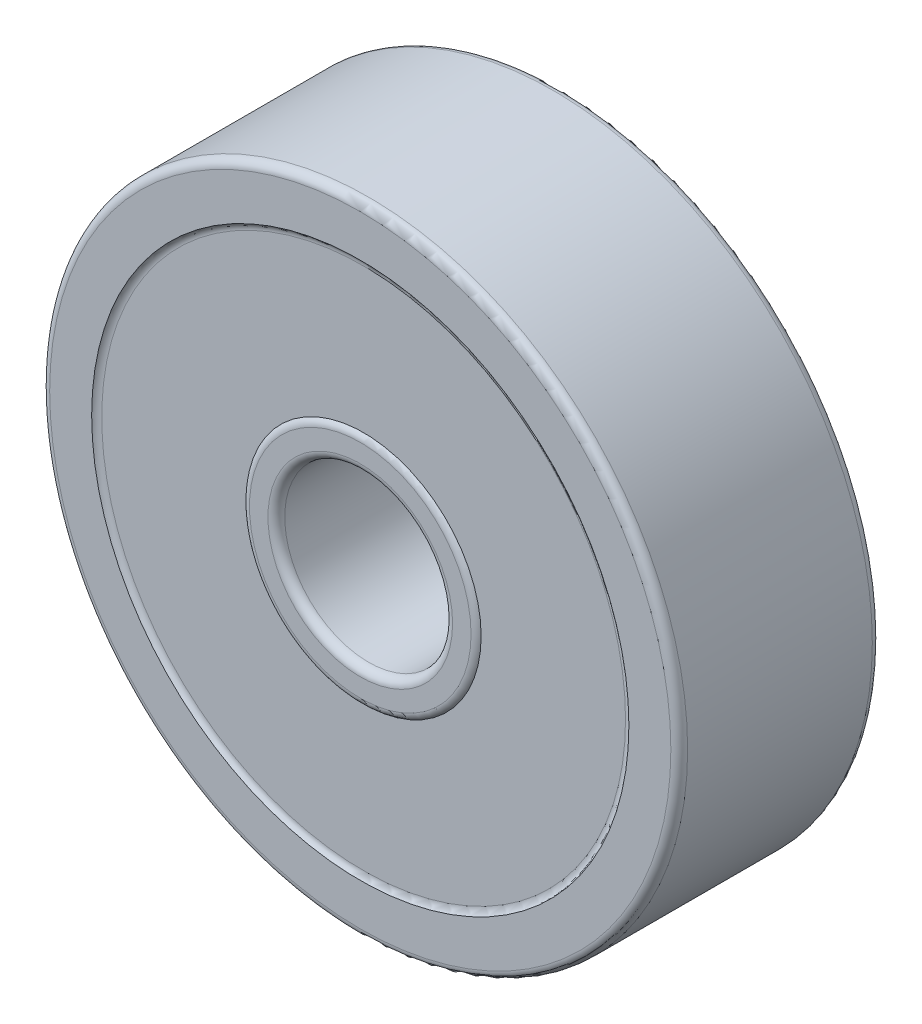
ISO-10303-21;
HEADER;
FILE_DESCRIPTION(('STEP AP214'),'2;1');
FILE_NAME('part.step','',(''),(''),'','','');
FILE_SCHEMA(('AUTOMOTIVE_DESIGN { 1 0 10303 214 1 1 1 1 }'));
ENDSEC;
DATA;
#1=APPLICATION_CONTEXT('core data for automotive mechanical design processes');
#2=APPLICATION_PROTOCOL_DEFINITION('international standard','automotive_design',2000,#1);
#3=PRODUCT_CONTEXT('',#1,'mechanical');
#4=PRODUCT('Part','Part','',(#3));
#5=PRODUCT_RELATED_PRODUCT_CATEGORY('part','',(#4));
#6=PRODUCT_DEFINITION_FORMATION('','',#4);
#7=PRODUCT_DEFINITION_CONTEXT('part definition',#1,'design');
#8=PRODUCT_DEFINITION('design','',#6,#7);
#9=PRODUCT_DEFINITION_SHAPE('','',#8);
#10=(LENGTH_UNIT() NAMED_UNIT(*) SI_UNIT(.MILLI.,.METRE.));
#11=(NAMED_UNIT(*) PLANE_ANGLE_UNIT() SI_UNIT($,.RADIAN.));
#12=(NAMED_UNIT(*) SI_UNIT($,.STERADIAN.) SOLID_ANGLE_UNIT());
#13=UNCERTAINTY_MEASURE_WITH_UNIT(LENGTH_MEASURE(1.E-05),#10,'distance_accuracy_value','');
#14=(GEOMETRIC_REPRESENTATION_CONTEXT(3) GLOBAL_UNCERTAINTY_ASSIGNED_CONTEXT((#13)) GLOBAL_UNIT_ASSIGNED_CONTEXT((#10,
#11,#12)) REPRESENTATION_CONTEXT('',''));
#15=CARTESIAN_POINT('',(0.,0.,0.));
#16=DIRECTION('',(0.,0.,1.));
#17=DIRECTION('',(1.,0.,0.));
#18=AXIS2_PLACEMENT_3D('',#15,#16,#17);
#19=CARTESIAN_POINT('',(0.,0.,-3.));
#20=DIRECTION('',(0.,0.,1.));
#21=DIRECTION('',(1.,0.,0.));
#22=AXIS2_PLACEMENT_3D('',#19,#20,#21);
#23=CYLINDRICAL_SURFACE('',#22,9.5);
#24=CARTESIAN_POINT('',(0.,0.,-2.75));
#25=DIRECTION('',(0.,0.,1.));
#26=DIRECTION('',(1.,0.,0.));
#27=AXIS2_PLACEMENT_3D('',#24,#25,#26);
#28=CIRCLE('',#27,9.5);
#29=CARTESIAN_POINT('',(9.5,0.,-2.75));
#30=VERTEX_POINT('',#29);
#31=EDGE_CURVE('E63',#30,#30,#28,.T.);
#32=ORIENTED_EDGE('',*,*,#31,.T.);
#33=EDGE_LOOP('',(#32));
#34=FACE_BOUND('',#33,.T.);
#35=CARTESIAN_POINT('',(0.,0.,2.75));
#36=DIRECTION('',(0.,0.,1.));
#37=DIRECTION('',(1.,0.,0.));
#38=AXIS2_PLACEMENT_3D('',#35,#36,#37);
#39=CIRCLE('',#38,9.5);
#40=CARTESIAN_POINT('',(9.5,0.,2.75));
#41=VERTEX_POINT('',#40);
#42=EDGE_CURVE('E66',#41,#41,#39,.F.);
#43=ORIENTED_EDGE('',*,*,#42,.T.);
#44=EDGE_LOOP('',(#43));
#45=FACE_BOUND('',#44,.T.);
#46=ADVANCED_FACE('F31',(#34,#45),#23,.T.);
#47=CARTESIAN_POINT('',(0.,0.,-3.));
#48=DIRECTION('',(0.,0.,1.));
#49=DIRECTION('',(1.,0.,0.));
#50=AXIS2_PLACEMENT_3D('',#47,#48,#49);
#51=PLANE('',#50);
#52=CARTESIAN_POINT('',(0.,0.,-3.));
#53=DIRECTION('',(0.,0.,1.));
#54=DIRECTION('',(1.,0.,0.));
#55=AXIS2_PLACEMENT_3D('',#52,#53,#54);
#56=CIRCLE('',#55,9.25);
#57=CARTESIAN_POINT('',(9.25,0.,-3.));
#58=VERTEX_POINT('',#57);
#59=EDGE_CURVE('E57',#58,#58,#56,.F.);
#60=ORIENTED_EDGE('',*,*,#59,.T.);
#61=EDGE_LOOP('',(#60));
#62=FACE_BOUND('',#61,.T.);
#63=CARTESIAN_POINT('',(0.,0.,-3.));
#64=DIRECTION('',(0.,0.,1.));
#65=DIRECTION('',(1.,0.,0.));
#66=AXIS2_PLACEMENT_3D('',#63,#64,#65);
#67=CIRCLE('',#66,8.2);
#68=CARTESIAN_POINT('',(8.2,0.,-3.));
#69=VERTEX_POINT('',#68);
#70=EDGE_CURVE('E60',#69,#69,#67,.T.);
#71=ORIENTED_EDGE('',*,*,#70,.T.);
#72=EDGE_LOOP('',(#71));
#73=FACE_BOUND('',#72,.T.);
#74=ADVANCED_FACE('F115',(#62,#73),#51,.F.);
#75=CARTESIAN_POINT('',(0.,0.,3.));
#76=DIRECTION('',(0.,0.,1.));
#77=DIRECTION('',(1.,0.,0.));
#78=AXIS2_PLACEMENT_3D('',#75,#76,#77);
#79=PLANE('',#78);
#80=CARTESIAN_POINT('',(0.,0.,3.));
#81=DIRECTION('',(0.,0.,1.));
#82=DIRECTION('',(1.,0.,0.));
#83=AXIS2_PLACEMENT_3D('',#80,#81,#82);
#84=CIRCLE('',#83,9.25);
#85=CARTESIAN_POINT('',(9.25,0.,3.));
#86=VERTEX_POINT('',#85);
#87=EDGE_CURVE('E10',#86,#86,#84,.T.);
#88=ORIENTED_EDGE('',*,*,#87,.T.);
#89=EDGE_LOOP('',(#88));
#90=FACE_BOUND('',#89,.T.);
#91=CARTESIAN_POINT('',(0.,0.,3.));
#92=DIRECTION('',(0.,0.,1.));
#93=DIRECTION('',(1.,0.,0.));
#94=AXIS2_PLACEMENT_3D('',#91,#92,#93);
#95=CIRCLE('',#94,8.);
#96=CARTESIAN_POINT('',(8.,0.,3.));
#97=VERTEX_POINT('',#96);
#98=EDGE_CURVE('E75',#97,#97,#95,.F.);
#99=ORIENTED_EDGE('',*,*,#98,.T.);
#100=EDGE_LOOP('',(#99));
#101=FACE_BOUND('',#100,.T.);
#102=ADVANCED_FACE('F95',(#90,#101),#79,.T.);
#103=CARTESIAN_POINT('',(0.,0.,-2.9));
#104=DIRECTION('',(0.,0.,1.));
#105=DIRECTION('',(1.,0.,0.));
#106=AXIS2_PLACEMENT_3D('',#103,#104,#105);
#107=PLANE('',#106);
#108=CARTESIAN_POINT('',(0.,0.,-2.9));
#109=DIRECTION('',(0.,0.,1.));
#110=DIRECTION('',(1.,0.,0.));
#111=AXIS2_PLACEMENT_3D('',#108,#109,#110);
#112=CIRCLE('',#111,3.5);
#113=CARTESIAN_POINT('',(3.5,0.,-2.9));
#114=VERTEX_POINT('',#113);
#115=EDGE_CURVE('E84',#114,#114,#112,.F.);
#116=ORIENTED_EDGE('',*,*,#115,.F.);
#117=EDGE_LOOP('',(#116));
#118=FACE_BOUND('',#117,.T.);
#119=CARTESIAN_POINT('',(0.,0.,-2.9));
#120=DIRECTION('',(0.,0.,1.));
#121=DIRECTION('',(1.,0.,0.));
#122=AXIS2_PLACEMENT_3D('',#119,#120,#121);
#123=CIRCLE('',#122,8.);
#124=CARTESIAN_POINT('',(8.,0.,-2.9));
#125=VERTEX_POINT('',#124);
#126=EDGE_CURVE('E78',#125,#125,#123,.T.);
#127=ORIENTED_EDGE('',*,*,#126,.F.);
#128=EDGE_LOOP('',(#127));
#129=FACE_BOUND('',#128,.T.);
#130=ADVANCED_FACE('F91',(#118,#129),#107,.F.);
#131=CARTESIAN_POINT('',(0.,0.,2.9));
#132=DIRECTION('',(0.,0.,1.));
#133=DIRECTION('',(1.,0.,0.));
#134=AXIS2_PLACEMENT_3D('',#131,#132,#133);
#135=PLANE('',#134);
#136=CARTESIAN_POINT('',(0.,0.,2.9));
#137=DIRECTION('',(0.,0.,1.));
#138=DIRECTION('',(1.,0.,0.));
#139=AXIS2_PLACEMENT_3D('',#136,#137,#138);
#140=CIRCLE('',#139,7.8);
#141=CARTESIAN_POINT('',(7.8,0.,2.9));
#142=VERTEX_POINT('',#141);
#143=EDGE_CURVE('E38',#142,#142,#140,.T.);
#144=ORIENTED_EDGE('',*,*,#143,.T.);
#145=EDGE_LOOP('',(#144));
#146=FACE_BOUND('',#145,.T.);
#147=CARTESIAN_POINT('',(0.,0.,2.9));
#148=DIRECTION('',(0.,0.,1.));
#149=DIRECTION('',(1.,0.,0.));
#150=AXIS2_PLACEMENT_3D('',#147,#148,#149);
#151=CIRCLE('',#150,3.5);
#152=CARTESIAN_POINT('',(3.5,0.,2.9));
#153=VERTEX_POINT('',#152);
#154=EDGE_CURVE('E81',#153,#153,#151,.T.);
#155=ORIENTED_EDGE('',*,*,#154,.F.);
#156=EDGE_LOOP('',(#155));
#157=FACE_BOUND('',#156,.T.);
#158=ADVANCED_FACE('F94',(#146,#157),#135,.T.);
#159=CARTESIAN_POINT('',(0.,0.,-3.));
#160=DIRECTION('',(0.,0.,1.));
#161=DIRECTION('',(1.,0.,0.));
#162=AXIS2_PLACEMENT_3D('',#159,#160,#161);
#163=PLANE('',#162);
#164=CARTESIAN_POINT('',(0.,0.,-3.));
#165=DIRECTION('',(0.,0.,1.));
#166=DIRECTION('',(1.,0.,0.));
#167=AXIS2_PLACEMENT_3D('',#164,#165,#166);
#168=CIRCLE('',#167,3.3);
#169=CARTESIAN_POINT('',(3.3,0.,-3.));
#170=VERTEX_POINT('',#169);
#171=EDGE_CURVE('E51',#170,#170,#168,.F.);
#172=ORIENTED_EDGE('',*,*,#171,.T.);
#173=EDGE_LOOP('',(#172));
#174=FACE_BOUND('',#173,.T.);
#175=CARTESIAN_POINT('',(0.,0.,-3.));
#176=DIRECTION('',(0.,0.,1.));
#177=DIRECTION('',(1.,0.,0.));
#178=AXIS2_PLACEMENT_3D('',#175,#176,#177);
#179=CIRCLE('',#178,2.75);
#180=CARTESIAN_POINT('',(2.75,0.,-3.));
#181=VERTEX_POINT('',#180);
#182=EDGE_CURVE('E54',#181,#181,#179,.T.);
#183=ORIENTED_EDGE('',*,*,#182,.T.);
#184=EDGE_LOOP('',(#183));
#185=FACE_BOUND('',#184,.T.);
#186=ADVANCED_FACE('F142',(#174,#185),#163,.F.);
#187=CARTESIAN_POINT('',(0.,0.,-3.));
#188=DIRECTION('',(0.,0.,1.));
#189=DIRECTION('',(1.,0.,0.));
#190=AXIS2_PLACEMENT_3D('',#187,#188,#189);
#191=CYLINDRICAL_SURFACE('',#190,2.5);
#192=CARTESIAN_POINT('',(0.,0.,-2.75));
#193=DIRECTION('',(0.,0.,1.));
#194=DIRECTION('',(1.,0.,0.));
#195=AXIS2_PLACEMENT_3D('',#192,#193,#194);
#196=CIRCLE('',#195,2.5);
#197=CARTESIAN_POINT('',(2.5,0.,-2.75));
#198=VERTEX_POINT('',#197);
#199=EDGE_CURVE('E42',#198,#198,#196,.F.);
#200=ORIENTED_EDGE('',*,*,#199,.T.);
#201=EDGE_LOOP('',(#200));
#202=FACE_BOUND('',#201,.T.);
#203=CARTESIAN_POINT('',(0.,0.,2.75));
#204=DIRECTION('',(0.,0.,1.));
#205=DIRECTION('',(1.,0.,0.));
#206=AXIS2_PLACEMENT_3D('',#203,#204,#205);
#207=CIRCLE('',#206,2.5);
#208=CARTESIAN_POINT('',(2.5,0.,2.75));
#209=VERTEX_POINT('',#208);
#210=EDGE_CURVE('E46',#209,#209,#207,.T.);
#211=ORIENTED_EDGE('',*,*,#210,.T.);
#212=EDGE_LOOP('',(#211));
#213=FACE_BOUND('',#212,.T.);
#214=ADVANCED_FACE('F134',(#202,#213),#191,.F.);
#215=CARTESIAN_POINT('',(0.,0.,3.));
#216=DIRECTION('',(0.,0.,1.));
#217=DIRECTION('',(1.,0.,0.));
#218=AXIS2_PLACEMENT_3D('',#215,#216,#217);
#219=PLANE('',#218);
#220=CARTESIAN_POINT('',(0.,0.,3.));
#221=DIRECTION('',(0.,0.,1.));
#222=DIRECTION('',(1.,0.,0.));
#223=AXIS2_PLACEMENT_3D('',#220,#221,#222);
#224=CIRCLE('',#223,3.3);
#225=CARTESIAN_POINT('',(3.3,0.,3.));
#226=VERTEX_POINT('',#225);
#227=EDGE_CURVE('E69',#226,#226,#224,.T.);
#228=ORIENTED_EDGE('',*,*,#227,.T.);
#229=EDGE_LOOP('',(#228));
#230=FACE_BOUND('',#229,.T.);
#231=CARTESIAN_POINT('',(0.,0.,3.));
#232=DIRECTION('',(0.,0.,1.));
#233=DIRECTION('',(1.,0.,0.));
#234=AXIS2_PLACEMENT_3D('',#231,#232,#233);
#235=CIRCLE('',#234,2.75);
#236=CARTESIAN_POINT('',(2.75,0.,3.));
#237=VERTEX_POINT('',#236);
#238=EDGE_CURVE('E72',#237,#237,#235,.F.);
#239=ORIENTED_EDGE('',*,*,#238,.T.);
#240=EDGE_LOOP('',(#239));
#241=FACE_BOUND('',#240,.T.);
#242=ADVANCED_FACE('F129',(#230,#241),#219,.T.);
#243=CARTESIAN_POINT('',(0.,0.,2.75));
#244=DIRECTION('',(0.,0.,-1.));
#245=DIRECTION('',(-1.,0.,0.));
#246=AXIS2_PLACEMENT_3D('',#243,#244,#245);
#247=TOROIDAL_SURFACE('',#246,3.3,0.25);
#248=ORIENTED_EDGE('',*,*,#227,.F.);
#249=EDGE_LOOP('',(#248));
#250=FACE_BOUND('',#249,.T.);
#251=ORIENTED_EDGE('',*,*,#154,.T.);
#252=EDGE_LOOP('',(#251));
#253=FACE_BOUND('',#252,.T.);
#254=ADVANCED_FACE('F110',(#250,#253),#247,.T.);
#255=CARTESIAN_POINT('',(0.,0.,-2.75));
#256=DIRECTION('',(0.,0.,1.));
#257=DIRECTION('',(1.,0.,0.));
#258=AXIS2_PLACEMENT_3D('',#255,#256,#257);
#259=TOROIDAL_SURFACE('',#258,9.25,0.25);
#260=ORIENTED_EDGE('',*,*,#59,.F.);
#261=EDGE_LOOP('',(#260));
#262=FACE_BOUND('',#261,.T.);
#263=ORIENTED_EDGE('',*,*,#31,.F.);
#264=EDGE_LOOP('',(#263));
#265=FACE_BOUND('',#264,.T.);
#266=ADVANCED_FACE('F101',(#262,#265),#259,.T.);
#267=CARTESIAN_POINT('',(0.,0.,-2.75));
#268=DIRECTION('',(0.,0.,1.));
#269=DIRECTION('',(1.,0.,0.));
#270=AXIS2_PLACEMENT_3D('',#267,#268,#269);
#271=TOROIDAL_SURFACE('',#270,8.2,0.25);
#272=ORIENTED_EDGE('',*,*,#70,.F.);
#273=EDGE_LOOP('',(#272));
#274=FACE_BOUND('',#273,.T.);
#275=ORIENTED_EDGE('',*,*,#126,.T.);
#276=EDGE_LOOP('',(#275));
#277=FACE_BOUND('',#276,.T.);
#278=ADVANCED_FACE('F99',(#274,#277),#271,.T.);
#279=CARTESIAN_POINT('',(0.,0.,-2.75));
#280=DIRECTION('',(0.,0.,-1.));
#281=DIRECTION('',(-1.,0.,0.));
#282=AXIS2_PLACEMENT_3D('',#279,#280,#281);
#283=TOROIDAL_SURFACE('',#282,3.3,0.25);
#284=ORIENTED_EDGE('',*,*,#115,.T.);
#285=EDGE_LOOP('',(#284));
#286=FACE_BOUND('',#285,.T.);
#287=ORIENTED_EDGE('',*,*,#171,.F.);
#288=EDGE_LOOP('',(#287));
#289=FACE_BOUND('',#288,.T.);
#290=ADVANCED_FACE('F88',(#286,#289),#283,.T.);
#291=CARTESIAN_POINT('',(0.,0.,-2.75));
#292=DIRECTION('',(0.,0.,1.));
#293=DIRECTION('',(1.,0.,0.));
#294=AXIS2_PLACEMENT_3D('',#291,#292,#293);
#295=TOROIDAL_SURFACE('',#294,2.75,0.25);
#296=ORIENTED_EDGE('',*,*,#199,.F.);
#297=EDGE_LOOP('',(#296));
#298=FACE_BOUND('',#297,.T.);
#299=ORIENTED_EDGE('',*,*,#182,.F.);
#300=EDGE_LOOP('',(#299));
#301=FACE_BOUND('',#300,.T.);
#302=ADVANCED_FACE('F108',(#298,#301),#295,.T.);
#303=CARTESIAN_POINT('',(0.,0.,3.15));
#304=DIRECTION('',(0.,0.,-1.));
#305=DIRECTION('',(-1.,0.,0.));
#306=AXIS2_PLACEMENT_3D('',#303,#304,#305);
#307=TOROIDAL_SURFACE('',#306,7.8,0.25);
#308=ORIENTED_EDGE('',*,*,#98,.F.);
#309=EDGE_LOOP('',(#308));
#310=FACE_BOUND('',#309,.T.);
#311=ORIENTED_EDGE('',*,*,#143,.F.);
#312=EDGE_LOOP('',(#311));
#313=FACE_BOUND('',#312,.T.);
#314=ADVANCED_FACE('F163',(#310,#313),#307,.F.);
#315=CARTESIAN_POINT('',(0.,0.,2.75));
#316=DIRECTION('',(0.,0.,1.));
#317=DIRECTION('',(1.,0.,0.));
#318=AXIS2_PLACEMENT_3D('',#315,#316,#317);
#319=TOROIDAL_SURFACE('',#318,9.25,0.25);
#320=ORIENTED_EDGE('',*,*,#42,.F.);
#321=EDGE_LOOP('',(#320));
#322=FACE_BOUND('',#321,.T.);
#323=ORIENTED_EDGE('',*,*,#87,.F.);
#324=EDGE_LOOP('',(#323));
#325=FACE_BOUND('',#324,.T.);
#326=ADVANCED_FACE('F158',(#322,#325),#319,.T.);
#327=CARTESIAN_POINT('',(0.,0.,2.75));
#328=DIRECTION('',(0.,0.,1.));
#329=DIRECTION('',(1.,0.,0.));
#330=AXIS2_PLACEMENT_3D('',#327,#328,#329);
#331=TOROIDAL_SURFACE('',#330,2.75,0.25);
#332=ORIENTED_EDGE('',*,*,#238,.F.);
#333=EDGE_LOOP('',(#332));
#334=FACE_BOUND('',#333,.T.);
#335=ORIENTED_EDGE('',*,*,#210,.F.);
#336=EDGE_LOOP('',(#335));
#337=FACE_BOUND('',#336,.T.);
#338=ADVANCED_FACE('F33',(#334,#337),#331,.T.);
#339=CLOSED_SHELL('',(#46,#74,#102,#130,#158,#186,#214,#242,#254,#266,#278,#290,#302,#314,#326,#338));
#340=MANIFOLD_SOLID_BREP('B2',#339);
#341=ADVANCED_BREP_SHAPE_REPRESENTATION('',(#18,#340),#14);
#342=SHAPE_DEFINITION_REPRESENTATION(#9,#341);
ENDSEC;
END-ISO-10303-21;
